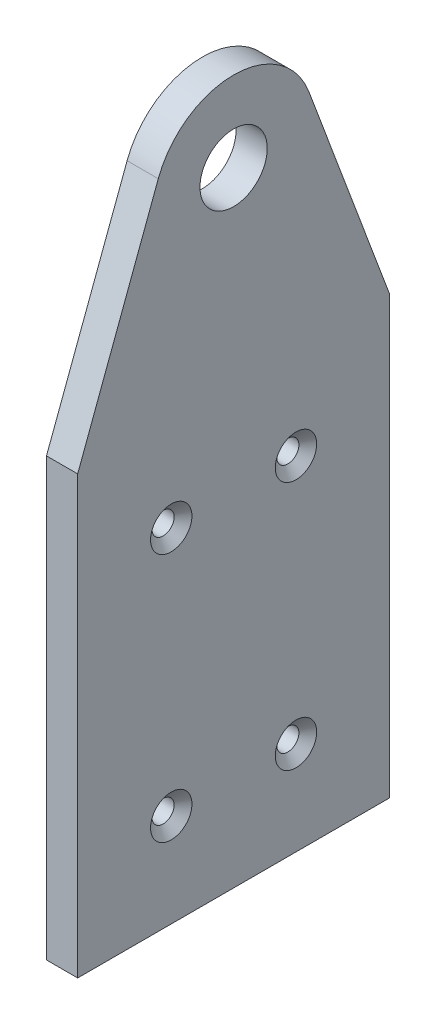
ISO-10303-21;
HEADER;
FILE_DESCRIPTION(('STEP AP214'),'2;1');
FILE_NAME('part.step','',(''),(''),'','','');
FILE_SCHEMA(('AUTOMOTIVE_DESIGN { 1 0 10303 214 1 1 1 1 }'));
ENDSEC;
DATA;
#1=APPLICATION_CONTEXT('core data for automotive mechanical design processes');
#2=APPLICATION_PROTOCOL_DEFINITION('international standard','automotive_design',2000,#1);
#3=PRODUCT_CONTEXT('',#1,'mechanical');
#4=PRODUCT('Part','Part','',(#3));
#5=PRODUCT_RELATED_PRODUCT_CATEGORY('part','',(#4));
#6=PRODUCT_DEFINITION_FORMATION('','',#4);
#7=PRODUCT_DEFINITION_CONTEXT('part definition',#1,'design');
#8=PRODUCT_DEFINITION('design','',#6,#7);
#9=PRODUCT_DEFINITION_SHAPE('','',#8);
#10=(LENGTH_UNIT() NAMED_UNIT(*) SI_UNIT(.MILLI.,.METRE.));
#11=(NAMED_UNIT(*) PLANE_ANGLE_UNIT() SI_UNIT($,.RADIAN.));
#12=(NAMED_UNIT(*) SI_UNIT($,.STERADIAN.) SOLID_ANGLE_UNIT());
#13=UNCERTAINTY_MEASURE_WITH_UNIT(LENGTH_MEASURE(1.E-05),#10,'distance_accuracy_value','');
#14=(GEOMETRIC_REPRESENTATION_CONTEXT(3) GLOBAL_UNCERTAINTY_ASSIGNED_CONTEXT((#13)) GLOBAL_UNIT_ASSIGNED_CONTEXT((#10,
#11,#12)) REPRESENTATION_CONTEXT('',''));
#15=CARTESIAN_POINT('',(0.,0.,0.));
#16=DIRECTION('',(0.,0.,1.));
#17=DIRECTION('',(1.,0.,0.));
#18=AXIS2_PLACEMENT_3D('',#15,#16,#17);
#19=CARTESIAN_POINT('',(57.277,0.,261.238572280505));
#20=DIRECTION('',(-1.,0.,0.));
#21=DIRECTION('',(0.,0.,1.));
#22=AXIS2_PLACEMENT_3D('',#19,#20,#21);
#23=PLANE('',#22);
#24=CARTESIAN_POINT('',(57.277,-57.15,248.538572280505));
#25=DIRECTION('',(1.,0.,0.));
#26=DIRECTION('',(0.,0.,-1.));
#27=AXIS2_PLACEMENT_3D('',#24,#25,#26);
#28=CIRCLE('',#27,4.2164);
#29=CARTESIAN_POINT('',(57.277,-57.15,244.322172280505));
#30=VERTEX_POINT('',#29);
#31=EDGE_CURVE('E206',#30,#30,#28,.T.);
#32=ORIENTED_EDGE('',*,*,#31,.F.);
#33=EDGE_LOOP('',(#32));
#34=FACE_BOUND('',#33,.T.);
#35=CARTESIAN_POINT('',(57.277,-107.95,248.538572280505));
#36=DIRECTION('',(1.,0.,0.));
#37=DIRECTION('',(0.,0.,-1.));
#38=AXIS2_PLACEMENT_3D('',#35,#36,#37);
#39=CIRCLE('',#38,4.21639999999999);
#40=CARTESIAN_POINT('',(57.277,-107.95,244.322172280505));
#41=VERTEX_POINT('',#40);
#42=EDGE_CURVE('E213',#41,#41,#39,.T.);
#43=ORIENTED_EDGE('',*,*,#42,.F.);
#44=EDGE_LOOP('',(#43));
#45=FACE_BOUND('',#44,.T.);
#46=CARTESIAN_POINT('',(57.277,-107.95,273.938572280505));
#47=DIRECTION('',(1.,0.,0.));
#48=DIRECTION('',(0.,0.,-1.));
#49=AXIS2_PLACEMENT_3D('',#46,#47,#48);
#50=CIRCLE('',#49,4.21639999999999);
#51=CARTESIAN_POINT('',(57.277,-107.95,269.722172280505));
#52=VERTEX_POINT('',#51);
#53=EDGE_CURVE('E222',#52,#52,#50,.T.);
#54=ORIENTED_EDGE('',*,*,#53,.F.);
#55=EDGE_LOOP('',(#54));
#56=FACE_BOUND('',#55,.T.);
#57=CARTESIAN_POINT('',(57.277,-57.15,273.938572280505));
#58=DIRECTION('',(1.,0.,0.));
#59=DIRECTION('',(0.,0.,-1.));
#60=AXIS2_PLACEMENT_3D('',#57,#58,#59);
#61=CIRCLE('',#60,4.2164);
#62=CARTESIAN_POINT('',(57.277,-57.15,269.722172280505));
#63=VERTEX_POINT('',#62);
#64=EDGE_CURVE('E231',#63,#63,#61,.T.);
#65=ORIENTED_EDGE('',*,*,#64,.F.);
#66=EDGE_LOOP('',(#65));
#67=FACE_BOUND('',#66,.T.);
#68=DIRECTION('',(0.,-1.,0.));
#69=VECTOR('',#68,1.);
#70=CARTESIAN_POINT('',(57.277,-127.,292.988572280505));
#71=LINE('',#70,#69);
#72=CARTESIAN_POINT('',(57.277,-38.1,292.988572280505));
#73=VERTEX_POINT('',#72);
#74=CARTESIAN_POINT('',(57.277,-127.,292.988572280505));
#75=VERTEX_POINT('',#74);
#76=EDGE_CURVE('E132',#73,#75,#71,.T.);
#77=ORIENTED_EDGE('',*,*,#76,.T.);
#78=DIRECTION('',(0.,0.,-1.));
#79=VECTOR('',#78,1.);
#80=CARTESIAN_POINT('',(57.277,-127.,292.988572280505));
#81=LINE('',#80,#79);
#82=CARTESIAN_POINT('',(57.277,-127.,229.488572280505));
#83=VERTEX_POINT('',#82);
#84=EDGE_CURVE('E90',#75,#83,#81,.T.);
#85=ORIENTED_EDGE('',*,*,#84,.T.);
#86=DIRECTION('',(0.,1.,0.));
#87=VECTOR('',#86,1.);
#88=CARTESIAN_POINT('',(57.277,-38.1,229.488572280505));
#89=LINE('',#88,#87);
#90=CARTESIAN_POINT('',(57.277,-38.1,229.488572280505));
#91=VERTEX_POINT('',#90);
#92=EDGE_CURVE('E103',#83,#91,#89,.T.);
#93=ORIENTED_EDGE('',*,*,#92,.T.);
#94=DIRECTION('',(0.,0.936511682695809,0.350636375999788));
#95=VECTOR('',#94,1.);
#96=CARTESIAN_POINT('',(57.277,5.74167065699653,245.903193476361));
#97=LINE('',#96,#95);
#98=CARTESIAN_POINT('',(57.277,5.74167065699653,245.903193476361));
#99=VERTEX_POINT('',#98);
#100=EDGE_CURVE('E97',#91,#99,#97,.T.);
#101=ORIENTED_EDGE('',*,*,#100,.T.);
#102=CARTESIAN_POINT('',(57.277,0.,261.238572280505));
#103=DIRECTION('',(1.,0.,0.));
#104=DIRECTION('',(0.,0.,1.));
#105=AXIS2_PLACEMENT_3D('',#102,#103,#104);
#106=CIRCLE('',#105,16.375);
#107=CARTESIAN_POINT('',(57.277,5.74167065699653,276.573951084649));
#108=VERTEX_POINT('',#107);
#109=EDGE_CURVE('E101',#99,#108,#106,.T.);
#110=ORIENTED_EDGE('',*,*,#109,.T.);
#111=DIRECTION('',(0.,-0.936511682695809,0.350636375999788));
#112=VECTOR('',#111,1.);
#113=CARTESIAN_POINT('',(57.277,-38.1,292.988572280505));
#114=LINE('',#113,#112);
#115=EDGE_CURVE('E53',#108,#73,#114,.T.);
#116=ORIENTED_EDGE('',*,*,#115,.T.);
#117=EDGE_LOOP('',(#77,#85,#93,#101,#110,#116));
#118=FACE_BOUND('',#117,.T.);
#119=CARTESIAN_POINT('',(57.277,0.,261.238572280505));
#120=DIRECTION('',(1.,0.,0.));
#121=DIRECTION('',(0.,0.,-1.));
#122=AXIS2_PLACEMENT_3D('',#119,#120,#121);
#123=CIRCLE('',#122,6.85000000000002);
#124=CARTESIAN_POINT('',(57.277,0.,254.388572280505));
#125=VERTEX_POINT('',#124);
#126=EDGE_CURVE('E125',#125,#125,#123,.T.);
#127=ORIENTED_EDGE('',*,*,#126,.F.);
#128=EDGE_LOOP('',(#127));
#129=FACE_BOUND('',#128,.T.);
#130=ADVANCED_FACE('F36',(#34,#45,#56,#67,#118,#129),#23,.F.);
#131=CARTESIAN_POINT('',(50.927,0.,261.238572280505));
#132=DIRECTION('',(-1.,0.,0.));
#133=DIRECTION('',(0.,0.,1.));
#134=AXIS2_PLACEMENT_3D('',#131,#132,#133);
#135=PLANE('',#134);
#136=CARTESIAN_POINT('',(50.927,-57.15,248.538572280505));
#137=DIRECTION('',(1.,0.,0.));
#138=DIRECTION('',(0.,0.,-1.));
#139=AXIS2_PLACEMENT_3D('',#136,#137,#138);
#140=CIRCLE('',#139,2.24789999999998);
#141=CARTESIAN_POINT('',(50.927,-57.15,246.290672280505));
#142=VERTEX_POINT('',#141);
#143=EDGE_CURVE('E208',#142,#142,#140,.T.);
#144=ORIENTED_EDGE('',*,*,#143,.T.);
#145=EDGE_LOOP('',(#144));
#146=FACE_BOUND('',#145,.T.);
#147=CARTESIAN_POINT('',(50.927,-107.95,248.538572280505));
#148=DIRECTION('',(1.,0.,0.));
#149=DIRECTION('',(0.,0.,-1.));
#150=AXIS2_PLACEMENT_3D('',#147,#148,#149);
#151=CIRCLE('',#150,2.24789999999998);
#152=CARTESIAN_POINT('',(50.927,-107.95,246.290672280505));
#153=VERTEX_POINT('',#152);
#154=EDGE_CURVE('E219',#153,#153,#151,.T.);
#155=ORIENTED_EDGE('',*,*,#154,.T.);
#156=EDGE_LOOP('',(#155));
#157=FACE_BOUND('',#156,.T.);
#158=CARTESIAN_POINT('',(50.927,-107.95,273.938572280505));
#159=DIRECTION('',(1.,0.,0.));
#160=DIRECTION('',(0.,0.,-1.));
#161=AXIS2_PLACEMENT_3D('',#158,#159,#160);
#162=CIRCLE('',#161,2.24789999999998);
#163=CARTESIAN_POINT('',(50.927,-107.95,271.690672280505));
#164=VERTEX_POINT('',#163);
#165=EDGE_CURVE('E228',#164,#164,#162,.T.);
#166=ORIENTED_EDGE('',*,*,#165,.T.);
#167=EDGE_LOOP('',(#166));
#168=FACE_BOUND('',#167,.T.);
#169=CARTESIAN_POINT('',(50.927,-57.15,273.938572280505));
#170=DIRECTION('',(1.,0.,0.));
#171=DIRECTION('',(0.,0.,-1.));
#172=AXIS2_PLACEMENT_3D('',#169,#170,#171);
#173=CIRCLE('',#172,2.24789999999998);
#174=CARTESIAN_POINT('',(50.927,-57.15,271.690672280505));
#175=VERTEX_POINT('',#174);
#176=EDGE_CURVE('E237',#175,#175,#173,.T.);
#177=ORIENTED_EDGE('',*,*,#176,.T.);
#178=EDGE_LOOP('',(#177));
#179=FACE_BOUND('',#178,.T.);
#180=DIRECTION('',(0.,-1.,0.));
#181=VECTOR('',#180,1.);
#182=CARTESIAN_POINT('',(50.927,-127.,292.988572280505));
#183=LINE('',#182,#181);
#184=CARTESIAN_POINT('',(50.927,-38.1,292.988572280505));
#185=VERTEX_POINT('',#184);
#186=CARTESIAN_POINT('',(50.927,-127.,292.988572280505));
#187=VERTEX_POINT('',#186);
#188=EDGE_CURVE('E121',#185,#187,#183,.T.);
#189=ORIENTED_EDGE('',*,*,#188,.F.);
#190=DIRECTION('',(0.,-0.936511682695809,0.350636375999788));
#191=VECTOR('',#190,1.);
#192=CARTESIAN_POINT('',(50.927,-38.1,292.988572280505));
#193=LINE('',#192,#191);
#194=CARTESIAN_POINT('',(50.927,5.74167065699653,276.573951084649));
#195=VERTEX_POINT('',#194);
#196=EDGE_CURVE('E82',#195,#185,#193,.T.);
#197=ORIENTED_EDGE('',*,*,#196,.F.);
#198=CARTESIAN_POINT('',(50.927,0.,261.238572280505));
#199=DIRECTION('',(1.,0.,0.));
#200=DIRECTION('',(0.,0.,1.));
#201=AXIS2_PLACEMENT_3D('',#198,#199,#200);
#202=CIRCLE('',#201,16.375);
#203=CARTESIAN_POINT('',(50.927,5.74167065699653,245.903193476361));
#204=VERTEX_POINT('',#203);
#205=EDGE_CURVE('E76',#204,#195,#202,.T.);
#206=ORIENTED_EDGE('',*,*,#205,.F.);
#207=DIRECTION('',(0.,0.936511682695809,0.350636375999788));
#208=VECTOR('',#207,1.);
#209=CARTESIAN_POINT('',(50.927,5.74167065699653,245.903193476361));
#210=LINE('',#209,#208);
#211=CARTESIAN_POINT('',(50.927,-38.1,229.488572280505));
#212=VERTEX_POINT('',#211);
#213=EDGE_CURVE('E111',#212,#204,#210,.T.);
#214=ORIENTED_EDGE('',*,*,#213,.F.);
#215=DIRECTION('',(0.,1.,0.));
#216=VECTOR('',#215,1.);
#217=CARTESIAN_POINT('',(50.927,-38.1,229.488572280505));
#218=LINE('',#217,#216);
#219=CARTESIAN_POINT('',(50.927,-127.,229.488572280505));
#220=VERTEX_POINT('',#219);
#221=EDGE_CURVE('E127',#220,#212,#218,.T.);
#222=ORIENTED_EDGE('',*,*,#221,.F.);
#223=DIRECTION('',(0.,0.,-1.));
#224=VECTOR('',#223,1.);
#225=CARTESIAN_POINT('',(50.927,-127.,292.988572280505));
#226=LINE('',#225,#224);
#227=EDGE_CURVE('E124',#187,#220,#226,.T.);
#228=ORIENTED_EDGE('',*,*,#227,.F.);
#229=EDGE_LOOP('',(#189,#197,#206,#214,#222,#228));
#230=FACE_BOUND('',#229,.T.);
#231=CARTESIAN_POINT('',(50.927,0.,261.238572280505));
#232=DIRECTION('',(1.,0.,0.));
#233=DIRECTION('',(0.,0.,-1.));
#234=AXIS2_PLACEMENT_3D('',#231,#232,#233);
#235=CIRCLE('',#234,6.85000000000002);
#236=CARTESIAN_POINT('',(50.927,0.,254.388572280505));
#237=VERTEX_POINT('',#236);
#238=EDGE_CURVE('E240',#237,#237,#235,.T.);
#239=ORIENTED_EDGE('',*,*,#238,.T.);
#240=EDGE_LOOP('',(#239));
#241=FACE_BOUND('',#240,.T.);
#242=ADVANCED_FACE('F141',(#146,#157,#168,#179,#230,#241),#135,.T.);
#243=CARTESIAN_POINT('',(57.277,-127.,292.988572280505));
#244=DIRECTION('',(0.,0.,-1.));
#245=DIRECTION('',(-1.,0.,0.));
#246=AXIS2_PLACEMENT_3D('',#243,#244,#245);
#247=PLANE('',#246);
#248=ORIENTED_EDGE('',*,*,#188,.T.);
#249=DIRECTION('',(-1.,0.,0.));
#250=VECTOR('',#249,1.);
#251=CARTESIAN_POINT('',(57.277,-127.,292.988572280505));
#252=LINE('',#251,#250);
#253=EDGE_CURVE('E11',#75,#187,#252,.T.);
#254=ORIENTED_EDGE('',*,*,#253,.F.);
#255=ORIENTED_EDGE('',*,*,#76,.F.);
#256=DIRECTION('',(-1.,0.,0.));
#257=VECTOR('',#256,1.);
#258=CARTESIAN_POINT('',(57.277,-38.1,292.988572280505));
#259=LINE('',#258,#257);
#260=EDGE_CURVE('E117',#73,#185,#259,.T.);
#261=ORIENTED_EDGE('',*,*,#260,.T.);
#262=EDGE_LOOP('',(#248,#254,#255,#261));
#263=FACE_BOUND('',#262,.T.);
#264=ADVANCED_FACE('F38',(#263),#247,.F.);
#265=CARTESIAN_POINT('',(57.277,-127.,292.988572280505));
#266=DIRECTION('',(0.,1.,0.));
#267=DIRECTION('',(0.,0.,1.));
#268=AXIS2_PLACEMENT_3D('',#265,#266,#267);
#269=PLANE('',#268);
#270=ORIENTED_EDGE('',*,*,#227,.T.);
#271=DIRECTION('',(-1.,0.,0.));
#272=VECTOR('',#271,1.);
#273=CARTESIAN_POINT('',(57.277,-127.,229.488572280505));
#274=LINE('',#273,#272);
#275=EDGE_CURVE('E45',#83,#220,#274,.T.);
#276=ORIENTED_EDGE('',*,*,#275,.F.);
#277=ORIENTED_EDGE('',*,*,#84,.F.);
#278=ORIENTED_EDGE('',*,*,#253,.T.);
#279=EDGE_LOOP('',(#270,#276,#277,#278));
#280=FACE_BOUND('',#279,.T.);
#281=ADVANCED_FACE('F340',(#280),#269,.F.);
#282=CARTESIAN_POINT('',(57.277,-38.1,229.488572280505));
#283=DIRECTION('',(0.,0.,1.));
#284=DIRECTION('',(1.,0.,0.));
#285=AXIS2_PLACEMENT_3D('',#282,#283,#284);
#286=PLANE('',#285);
#287=ORIENTED_EDGE('',*,*,#221,.T.);
#288=DIRECTION('',(-1.,0.,0.));
#289=VECTOR('',#288,1.);
#290=CARTESIAN_POINT('',(57.277,-38.1,229.488572280505));
#291=LINE('',#290,#289);
#292=EDGE_CURVE('E112',#91,#212,#291,.T.);
#293=ORIENTED_EDGE('',*,*,#292,.F.);
#294=ORIENTED_EDGE('',*,*,#92,.F.);
#295=ORIENTED_EDGE('',*,*,#275,.T.);
#296=EDGE_LOOP('',(#287,#293,#294,#295));
#297=FACE_BOUND('',#296,.T.);
#298=ADVANCED_FACE('F138',(#297),#286,.F.);
#299=CARTESIAN_POINT('',(57.277,5.74167065699653,245.903193476361));
#300=DIRECTION('',(0.,-0.350636375999788,0.936511682695809));
#301=DIRECTION('',(0.,-0.936511682695809,-0.350636375999788));
#302=AXIS2_PLACEMENT_3D('',#299,#300,#301);
#303=PLANE('',#302);
#304=ORIENTED_EDGE('',*,*,#213,.T.);
#305=DIRECTION('',(-1.,0.,0.));
#306=VECTOR('',#305,1.);
#307=CARTESIAN_POINT('',(57.277,5.74167065699653,245.903193476361));
#308=LINE('',#307,#306);
#309=EDGE_CURVE('E108',#99,#204,#308,.T.);
#310=ORIENTED_EDGE('',*,*,#309,.F.);
#311=ORIENTED_EDGE('',*,*,#100,.F.);
#312=ORIENTED_EDGE('',*,*,#292,.T.);
#313=EDGE_LOOP('',(#304,#310,#311,#312));
#314=FACE_BOUND('',#313,.T.);
#315=ADVANCED_FACE('F109',(#314),#303,.F.);
#316=CARTESIAN_POINT('',(57.277,0.,261.238572280505));
#317=DIRECTION('',(-1.,0.,0.));
#318=DIRECTION('',(0.,0.,1.));
#319=AXIS2_PLACEMENT_3D('',#316,#317,#318);
#320=CYLINDRICAL_SURFACE('',#319,16.375);
#321=ORIENTED_EDGE('',*,*,#205,.T.);
#322=DIRECTION('',(-1.,0.,0.));
#323=VECTOR('',#322,1.);
#324=CARTESIAN_POINT('',(57.277,5.74167065699653,276.573951084649));
#325=LINE('',#324,#323);
#326=EDGE_CURVE('E113',#108,#195,#325,.T.);
#327=ORIENTED_EDGE('',*,*,#326,.F.);
#328=ORIENTED_EDGE('',*,*,#109,.F.);
#329=ORIENTED_EDGE('',*,*,#309,.T.);
#330=EDGE_LOOP('',(#321,#327,#328,#329));
#331=FACE_BOUND('',#330,.T.);
#332=ADVANCED_FACE('F115',(#331),#320,.T.);
#333=CARTESIAN_POINT('',(57.277,-38.1,292.988572280505));
#334=DIRECTION('',(0.,-0.350636375999788,-0.936511682695809));
#335=DIRECTION('',(0.,0.936511682695809,-0.350636375999788));
#336=AXIS2_PLACEMENT_3D('',#333,#334,#335);
#337=PLANE('',#336);
#338=ORIENTED_EDGE('',*,*,#196,.T.);
#339=ORIENTED_EDGE('',*,*,#260,.F.);
#340=ORIENTED_EDGE('',*,*,#115,.F.);
#341=ORIENTED_EDGE('',*,*,#326,.T.);
#342=EDGE_LOOP('',(#338,#339,#340,#341));
#343=FACE_BOUND('',#342,.T.);
#344=ADVANCED_FACE('F146',(#343),#337,.F.);
#345=CARTESIAN_POINT('',(57.277,0.,261.238572280505));
#346=DIRECTION('',(-1.,0.,0.));
#347=DIRECTION('',(0.,0.,1.));
#348=AXIS2_PLACEMENT_3D('',#345,#346,#347);
#349=CYLINDRICAL_SURFACE('',#348,6.85000000000002);
#350=ORIENTED_EDGE('',*,*,#126,.T.);
#351=EDGE_LOOP('',(#350));
#352=FACE_BOUND('',#351,.T.);
#353=ORIENTED_EDGE('',*,*,#238,.F.);
#354=EDGE_LOOP('',(#353));
#355=FACE_BOUND('',#354,.T.);
#356=ADVANCED_FACE('F148',(#352,#355),#349,.F.);
#357=CARTESIAN_POINT('',(57.277,-57.15,273.938572280505));
#358=DIRECTION('',(1.,0.,0.));
#359=DIRECTION('',(0.,0.,-1.));
#360=AXIS2_PLACEMENT_3D('',#357,#358,#359);
#361=CYLINDRICAL_SURFACE('',#360,2.24789999999999);
#362=ORIENTED_EDGE('',*,*,#176,.F.);
#363=EDGE_LOOP('',(#362));
#364=FACE_BOUND('',#363,.T.);
#365=CARTESIAN_POINT('',(55.6252323760275,-57.15,273.938572280505));
#366=DIRECTION('',(1.,0.,0.));
#367=DIRECTION('',(0.,0.,-1.));
#368=AXIS2_PLACEMENT_3D('',#365,#366,#367);
#369=CIRCLE('',#368,2.24789999999999);
#370=CARTESIAN_POINT('',(55.6252323760275,-57.15,271.690672280505));
#371=VERTEX_POINT('',#370);
#372=EDGE_CURVE('E234',#371,#371,#369,.T.);
#373=ORIENTED_EDGE('',*,*,#372,.T.);
#374=EDGE_LOOP('',(#373));
#375=FACE_BOUND('',#374,.T.);
#376=ADVANCED_FACE('F154',(#364,#375),#361,.F.);
#377=CARTESIAN_POINT('',(57.277,-57.15,273.938572280505));
#378=DIRECTION('',(1.,0.,0.));
#379=DIRECTION('',(0.,0.,-1.));
#380=AXIS2_PLACEMENT_3D('',#377,#378,#379);
#381=CONICAL_SURFACE('',#380,4.2164,0.87266462599717);
#382=ORIENTED_EDGE('',*,*,#372,.F.);
#383=EDGE_LOOP('',(#382));
#384=FACE_BOUND('',#383,.T.);
#385=ORIENTED_EDGE('',*,*,#64,.T.);
#386=EDGE_LOOP('',(#385));
#387=FACE_BOUND('',#386,.T.);
#388=ADVANCED_FACE('F171',(#384,#387),#381,.F.);
#389=CARTESIAN_POINT('',(57.277,-107.95,273.938572280505));
#390=DIRECTION('',(1.,0.,0.));
#391=DIRECTION('',(0.,0.,-1.));
#392=AXIS2_PLACEMENT_3D('',#389,#390,#391);
#393=CYLINDRICAL_SURFACE('',#392,2.24789999999998);
#394=ORIENTED_EDGE('',*,*,#165,.F.);
#395=EDGE_LOOP('',(#394));
#396=FACE_BOUND('',#395,.T.);
#397=CARTESIAN_POINT('',(55.6252323760275,-107.95,273.938572280505));
#398=DIRECTION('',(1.,0.,0.));
#399=DIRECTION('',(0.,0.,-1.));
#400=AXIS2_PLACEMENT_3D('',#397,#398,#399);
#401=CIRCLE('',#400,2.24789999999998);
#402=CARTESIAN_POINT('',(55.6252323760275,-107.95,271.690672280505));
#403=VERTEX_POINT('',#402);
#404=EDGE_CURVE('E225',#403,#403,#401,.T.);
#405=ORIENTED_EDGE('',*,*,#404,.T.);
#406=EDGE_LOOP('',(#405));
#407=FACE_BOUND('',#406,.T.);
#408=ADVANCED_FACE('F175',(#396,#407),#393,.F.);
#409=CARTESIAN_POINT('',(57.277,-107.95,273.938572280505));
#410=DIRECTION('',(1.,0.,0.));
#411=DIRECTION('',(0.,0.,-1.));
#412=AXIS2_PLACEMENT_3D('',#409,#410,#411);
#413=CONICAL_SURFACE('',#412,4.21639999999999,0.87266462599717);
#414=ORIENTED_EDGE('',*,*,#404,.F.);
#415=EDGE_LOOP('',(#414));
#416=FACE_BOUND('',#415,.T.);
#417=ORIENTED_EDGE('',*,*,#53,.T.);
#418=EDGE_LOOP('',(#417));
#419=FACE_BOUND('',#418,.T.);
#420=ADVANCED_FACE('F179',(#416,#419),#413,.F.);
#421=CARTESIAN_POINT('',(57.277,-107.95,248.538572280505));
#422=DIRECTION('',(1.,0.,0.));
#423=DIRECTION('',(0.,0.,-1.));
#424=AXIS2_PLACEMENT_3D('',#421,#422,#423);
#425=CYLINDRICAL_SURFACE('',#424,2.24789999999998);
#426=ORIENTED_EDGE('',*,*,#154,.F.);
#427=EDGE_LOOP('',(#426));
#428=FACE_BOUND('',#427,.T.);
#429=CARTESIAN_POINT('',(55.6252323760275,-107.95,248.538572280505));
#430=DIRECTION('',(1.,0.,0.));
#431=DIRECTION('',(0.,0.,-1.));
#432=AXIS2_PLACEMENT_3D('',#429,#430,#431);
#433=CIRCLE('',#432,2.24789999999998);
#434=CARTESIAN_POINT('',(55.6252323760275,-107.95,246.290672280505));
#435=VERTEX_POINT('',#434);
#436=EDGE_CURVE('E216',#435,#435,#433,.T.);
#437=ORIENTED_EDGE('',*,*,#436,.T.);
#438=EDGE_LOOP('',(#437));
#439=FACE_BOUND('',#438,.T.);
#440=ADVANCED_FACE('F183',(#428,#439),#425,.F.);
#441=CARTESIAN_POINT('',(57.277,-107.95,248.538572280505));
#442=DIRECTION('',(1.,0.,0.));
#443=DIRECTION('',(0.,0.,-1.));
#444=AXIS2_PLACEMENT_3D('',#441,#442,#443);
#445=CONICAL_SURFACE('',#444,4.21639999999999,0.87266462599717);
#446=ORIENTED_EDGE('',*,*,#436,.F.);
#447=EDGE_LOOP('',(#446));
#448=FACE_BOUND('',#447,.T.);
#449=ORIENTED_EDGE('',*,*,#42,.T.);
#450=EDGE_LOOP('',(#449));
#451=FACE_BOUND('',#450,.T.);
#452=ADVANCED_FACE('F187',(#448,#451),#445,.F.);
#453=CARTESIAN_POINT('',(57.277,-57.15,248.538572280505));
#454=DIRECTION('',(1.,0.,0.));
#455=DIRECTION('',(0.,0.,-1.));
#456=AXIS2_PLACEMENT_3D('',#453,#454,#455);
#457=CYLINDRICAL_SURFACE('',#456,2.24789999999999);
#458=ORIENTED_EDGE('',*,*,#143,.F.);
#459=EDGE_LOOP('',(#458));
#460=FACE_BOUND('',#459,.T.);
#461=CARTESIAN_POINT('',(55.6252323760275,-57.15,248.538572280505));
#462=DIRECTION('',(1.,0.,0.));
#463=DIRECTION('',(0.,0.,-1.));
#464=AXIS2_PLACEMENT_3D('',#461,#462,#463);
#465=CIRCLE('',#464,2.24789999999999);
#466=CARTESIAN_POINT('',(55.6252323760275,-57.15,246.290672280505));
#467=VERTEX_POINT('',#466);
#468=EDGE_CURVE('E204',#467,#467,#465,.T.);
#469=ORIENTED_EDGE('',*,*,#468,.T.);
#470=EDGE_LOOP('',(#469));
#471=FACE_BOUND('',#470,.T.);
#472=ADVANCED_FACE('F191',(#460,#471),#457,.F.);
#473=CARTESIAN_POINT('',(57.277,-57.15,248.538572280505));
#474=DIRECTION('',(1.,0.,0.));
#475=DIRECTION('',(0.,0.,-1.));
#476=AXIS2_PLACEMENT_3D('',#473,#474,#475);
#477=CONICAL_SURFACE('',#476,4.2164,0.87266462599717);
#478=ORIENTED_EDGE('',*,*,#468,.F.);
#479=EDGE_LOOP('',(#478));
#480=FACE_BOUND('',#479,.T.);
#481=ORIENTED_EDGE('',*,*,#31,.T.);
#482=EDGE_LOOP('',(#481));
#483=FACE_BOUND('',#482,.T.);
#484=ADVANCED_FACE('F195',(#480,#483),#477,.F.);
#485=CLOSED_SHELL('',(#130,#242,#264,#281,#298,#315,#332,#344,#356,#376,#388,#408,#420,#440,
#452,#472,#484));
#486=MANIFOLD_SOLID_BREP('B2',#485);
#487=ADVANCED_BREP_SHAPE_REPRESENTATION('',(#18,#486),#14);
#488=SHAPE_DEFINITION_REPRESENTATION(#9,#487);
ENDSEC;
END-ISO-10303-21;
